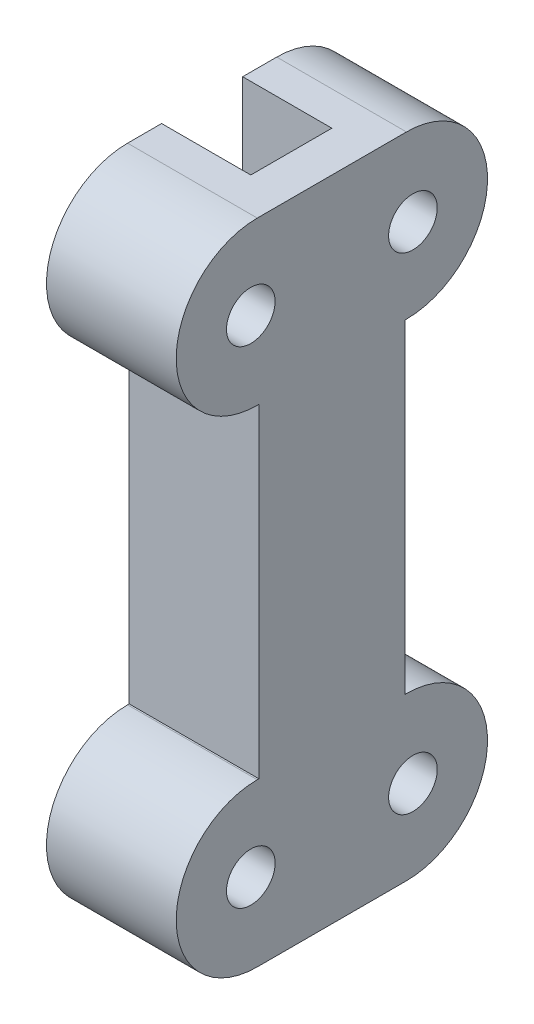
ISO-10303-21;
HEADER;
FILE_DESCRIPTION(('STEP AP214'),'2;1');
FILE_NAME('part.step','',(''),(''),'','','');
FILE_SCHEMA(('AUTOMOTIVE_DESIGN { 1 0 10303 214 1 1 1 1 }'));
ENDSEC;
DATA;
#1=APPLICATION_CONTEXT('core data for automotive mechanical design processes');
#2=APPLICATION_PROTOCOL_DEFINITION('international standard','automotive_design',2000,#1);
#3=PRODUCT_CONTEXT('',#1,'mechanical');
#4=PRODUCT('Part','Part','',(#3));
#5=PRODUCT_RELATED_PRODUCT_CATEGORY('part','',(#4));
#6=PRODUCT_DEFINITION_FORMATION('','',#4);
#7=PRODUCT_DEFINITION_CONTEXT('part definition',#1,'design');
#8=PRODUCT_DEFINITION('design','',#6,#7);
#9=PRODUCT_DEFINITION_SHAPE('','',#8);
#10=(LENGTH_UNIT() NAMED_UNIT(*) SI_UNIT(.MILLI.,.METRE.));
#11=(NAMED_UNIT(*) PLANE_ANGLE_UNIT() SI_UNIT($,.RADIAN.));
#12=(NAMED_UNIT(*) SI_UNIT($,.STERADIAN.) SOLID_ANGLE_UNIT());
#13=UNCERTAINTY_MEASURE_WITH_UNIT(LENGTH_MEASURE(1.E-05),#10,'distance_accuracy_value','');
#14=(GEOMETRIC_REPRESENTATION_CONTEXT(3) GLOBAL_UNCERTAINTY_ASSIGNED_CONTEXT((#13)) GLOBAL_UNIT_ASSIGNED_CONTEXT((#10,
#11,#12)) REPRESENTATION_CONTEXT('',''));
#15=CARTESIAN_POINT('',(0.,0.,0.));
#16=DIRECTION('',(0.,0.,1.));
#17=DIRECTION('',(1.,0.,0.));
#18=AXIS2_PLACEMENT_3D('',#15,#16,#17);
#19=CARTESIAN_POINT('',(8.,-20.,4.5));
#20=DIRECTION('',(0.,0.,-1.));
#21=DIRECTION('',(-1.,0.,0.));
#22=AXIS2_PLACEMENT_3D('',#19,#20,#21);
#23=PLANE('',#22);
#24=DIRECTION('',(-1.,0.,0.));
#25=VECTOR('',#24,1.);
#26=CARTESIAN_POINT('',(0.,-9.99999999999999,4.5));
#27=LINE('',#26,#25);
#28=CARTESIAN_POINT('',(8.,-9.99999999999999,4.5));
#29=VERTEX_POINT('',#28);
#30=CARTESIAN_POINT('',(0.,-9.99999999999999,4.5));
#31=VERTEX_POINT('',#30);
#32=EDGE_CURVE('E210',#29,#31,#27,.T.);
#33=ORIENTED_EDGE('',*,*,#32,.F.);
#34=DIRECTION('',(0.,-1.,0.));
#35=VECTOR('',#34,1.);
#36=CARTESIAN_POINT('',(8.,-20.,4.5));
#37=LINE('',#36,#35);
#38=CARTESIAN_POINT('',(8.,9.99999999999999,4.5));
#39=VERTEX_POINT('',#38);
#40=EDGE_CURVE('E66',#39,#29,#37,.T.);
#41=ORIENTED_EDGE('',*,*,#40,.F.);
#42=DIRECTION('',(-1.,0.,0.));
#43=VECTOR('',#42,1.);
#44=CARTESIAN_POINT('',(0.,9.99999999999999,4.5));
#45=LINE('',#44,#43);
#46=CARTESIAN_POINT('',(0.,9.99999999999999,4.5));
#47=VERTEX_POINT('',#46);
#48=EDGE_CURVE('E234',#39,#47,#45,.T.);
#49=ORIENTED_EDGE('',*,*,#48,.T.);
#50=DIRECTION('',(0.,-1.,0.));
#51=VECTOR('',#50,1.);
#52=CARTESIAN_POINT('',(0.,-20.,4.5));
#53=LINE('',#52,#51);
#54=EDGE_CURVE('E309',#47,#31,#53,.T.);
#55=ORIENTED_EDGE('',*,*,#54,.T.);
#56=EDGE_LOOP('',(#33,#41,#49,#55));
#57=FACE_BOUND('',#56,.T.);
#58=ADVANCED_FACE('F57',(#57),#23,.F.);
#59=CARTESIAN_POINT('',(8.,-20.,-4.5));
#60=DIRECTION('',(0.,0.,1.));
#61=DIRECTION('',(1.,0.,0.));
#62=AXIS2_PLACEMENT_3D('',#59,#60,#61);
#63=PLANE('',#62);
#64=DIRECTION('',(0.,1.,0.));
#65=VECTOR('',#64,1.);
#66=CARTESIAN_POINT('',(8.,-20.,-4.5));
#67=LINE('',#66,#65);
#68=CARTESIAN_POINT('',(8.,-9.99999999999999,-4.5));
#69=VERTEX_POINT('',#68);
#70=CARTESIAN_POINT('',(8.,9.99999999999999,-4.5));
#71=VERTEX_POINT('',#70);
#72=EDGE_CURVE('E74',#69,#71,#67,.T.);
#73=ORIENTED_EDGE('',*,*,#72,.F.);
#74=DIRECTION('',(-1.,0.,0.));
#75=VECTOR('',#74,1.);
#76=CARTESIAN_POINT('',(0.,-9.99999999999999,-4.5));
#77=LINE('',#76,#75);
#78=CARTESIAN_POINT('',(0.,-9.99999999999999,-4.5));
#79=VERTEX_POINT('',#78);
#80=EDGE_CURVE('E185',#69,#79,#77,.T.);
#81=ORIENTED_EDGE('',*,*,#80,.T.);
#82=DIRECTION('',(0.,1.,0.));
#83=VECTOR('',#82,1.);
#84=CARTESIAN_POINT('',(0.,-20.,-4.5));
#85=LINE('',#84,#83);
#86=CARTESIAN_POINT('',(0.,9.99999999999999,-4.5));
#87=VERTEX_POINT('',#86);
#88=EDGE_CURVE('E291',#79,#87,#85,.T.);
#89=ORIENTED_EDGE('',*,*,#88,.T.);
#90=DIRECTION('',(-1.,0.,0.));
#91=VECTOR('',#90,1.);
#92=CARTESIAN_POINT('',(0.,9.99999999999999,-4.5));
#93=LINE('',#92,#91);
#94=EDGE_CURVE('E255',#71,#87,#93,.T.);
#95=ORIENTED_EDGE('',*,*,#94,.F.);
#96=EDGE_LOOP('',(#73,#81,#89,#95));
#97=FACE_BOUND('',#96,.T.);
#98=ADVANCED_FACE('F59',(#97),#63,.F.);
#99=CARTESIAN_POINT('',(0.,0.,0.));
#100=DIRECTION('',(-1.,0.,0.));
#101=DIRECTION('',(0.,0.,1.));
#102=AXIS2_PLACEMENT_3D('',#99,#100,#101);
#103=PLANE('',#102);
#104=CARTESIAN_POINT('',(0.,-15.,5.));
#105=DIRECTION('',(-1.,0.,0.));
#106=DIRECTION('',(0.,0.,-1.));
#107=AXIS2_PLACEMENT_3D('',#104,#105,#106);
#108=CIRCLE('',#107,1.5);
#109=CARTESIAN_POINT('',(0.,-15.,3.5));
#110=VERTEX_POINT('',#109);
#111=EDGE_CURVE('E197',#110,#110,#108,.T.);
#112=ORIENTED_EDGE('',*,*,#111,.F.);
#113=EDGE_LOOP('',(#112));
#114=FACE_BOUND('',#113,.T.);
#115=CARTESIAN_POINT('',(0.,15.,5.));
#116=DIRECTION('',(1.,0.,0.));
#117=DIRECTION('',(0.,0.,-1.));
#118=AXIS2_PLACEMENT_3D('',#115,#116,#117);
#119=CIRCLE('',#118,1.5);
#120=CARTESIAN_POINT('',(0.,15.,3.5));
#121=VERTEX_POINT('',#120);
#122=EDGE_CURVE('E225',#121,#121,#119,.T.);
#123=ORIENTED_EDGE('',*,*,#122,.T.);
#124=EDGE_LOOP('',(#123));
#125=FACE_BOUND('',#124,.T.);
#126=DIRECTION('',(0.,1.,0.));
#127=VECTOR('',#126,1.);
#128=CARTESIAN_POINT('',(0.,-20.,2.5));
#129=LINE('',#128,#127);
#130=CARTESIAN_POINT('',(0.,-20.,2.5));
#131=VERTEX_POINT('',#130);
#132=CARTESIAN_POINT('',(0.,20.,2.5));
#133=VERTEX_POINT('',#132);
#134=EDGE_CURVE('E272',#131,#133,#129,.T.);
#135=ORIENTED_EDGE('',*,*,#134,.F.);
#136=DIRECTION('',(0.,0.,-1.));
#137=VECTOR('',#136,1.);
#138=CARTESIAN_POINT('',(0.,-20.,4.5));
#139=LINE('',#138,#137);
#140=CARTESIAN_POINT('',(0.,-20.,4.6));
#141=VERTEX_POINT('',#140);
#142=EDGE_CURVE('E61',#141,#131,#139,.T.);
#143=ORIENTED_EDGE('',*,*,#142,.F.);
#144=CARTESIAN_POINT('',(0.,-15.,4.6));
#145=DIRECTION('',(1.,0.,0.));
#146=DIRECTION('',(0.,0.,-1.));
#147=AXIS2_PLACEMENT_3D('',#144,#145,#146);
#148=CIRCLE('',#147,5.);
#149=CARTESIAN_POINT('',(0.,-9.99999999999999,4.6));
#150=VERTEX_POINT('',#149);
#151=EDGE_CURVE('E205',#150,#141,#148,.T.);
#152=ORIENTED_EDGE('',*,*,#151,.F.);
#153=DIRECTION('',(0.,0.,-1.));
#154=VECTOR('',#153,1.);
#155=CARTESIAN_POINT('',(0.,-9.99999999999999,4.6));
#156=LINE('',#155,#154);
#157=EDGE_CURVE('E219',#150,#31,#156,.T.);
#158=ORIENTED_EDGE('',*,*,#157,.T.);
#159=ORIENTED_EDGE('',*,*,#54,.F.);
#160=DIRECTION('',(0.,0.,-1.));
#161=VECTOR('',#160,1.);
#162=CARTESIAN_POINT('',(0.,9.99999999999999,4.6));
#163=LINE('',#162,#161);
#164=CARTESIAN_POINT('',(0.,9.99999999999999,4.6));
#165=VERTEX_POINT('',#164);
#166=EDGE_CURVE('E82',#165,#47,#163,.T.);
#167=ORIENTED_EDGE('',*,*,#166,.F.);
#168=CARTESIAN_POINT('',(0.,15.,4.6));
#169=DIRECTION('',(-1.,0.,0.));
#170=DIRECTION('',(0.,0.,-1.));
#171=AXIS2_PLACEMENT_3D('',#168,#169,#170);
#172=CIRCLE('',#171,5.);
#173=CARTESIAN_POINT('',(0.,20.,4.6));
#174=VERTEX_POINT('',#173);
#175=EDGE_CURVE('E229',#165,#174,#172,.T.);
#176=ORIENTED_EDGE('',*,*,#175,.T.);
#177=DIRECTION('',(0.,0.,1.));
#178=VECTOR('',#177,1.);
#179=CARTESIAN_POINT('',(0.,20.,4.5));
#180=LINE('',#179,#178);
#181=EDGE_CURVE('E306',#133,#174,#180,.T.);
#182=ORIENTED_EDGE('',*,*,#181,.F.);
#183=EDGE_LOOP('',(#135,#143,#152,#158,#159,#167,#176,#182));
#184=FACE_BOUND('',#183,.T.);
#185=ADVANCED_FACE('F326',(#114,#125,#184),#103,.T.);
#186=CARTESIAN_POINT('',(8.,20.,4.5));
#187=DIRECTION('',(0.,-1.,0.));
#188=DIRECTION('',(0.,0.,-1.));
#189=AXIS2_PLACEMENT_3D('',#186,#187,#188);
#190=PLANE('',#189);
#191=DIRECTION('',(0.,0.,-1.));
#192=VECTOR('',#191,1.);
#193=CARTESIAN_POINT('',(5.5,20.,-2.5));
#194=LINE('',#193,#192);
#195=CARTESIAN_POINT('',(5.5,20.,2.5));
#196=VERTEX_POINT('',#195);
#197=CARTESIAN_POINT('',(5.5,20.,-2.5));
#198=VERTEX_POINT('',#197);
#199=EDGE_CURVE('E276',#196,#198,#194,.T.);
#200=ORIENTED_EDGE('',*,*,#199,.F.);
#201=DIRECTION('',(-1.,0.,0.));
#202=VECTOR('',#201,1.);
#203=CARTESIAN_POINT('',(5.5,20.,2.5));
#204=LINE('',#203,#202);
#205=EDGE_CURVE('E286',#196,#133,#204,.T.);
#206=ORIENTED_EDGE('',*,*,#205,.T.);
#207=ORIENTED_EDGE('',*,*,#181,.T.);
#208=DIRECTION('',(1.,0.,0.));
#209=VECTOR('',#208,1.);
#210=CARTESIAN_POINT('',(0.,20.,4.6));
#211=LINE('',#210,#209);
#212=CARTESIAN_POINT('',(8.,20.,4.6));
#213=VERTEX_POINT('',#212);
#214=EDGE_CURVE('E238',#174,#213,#211,.T.);
#215=ORIENTED_EDGE('',*,*,#214,.T.);
#216=DIRECTION('',(0.,0.,1.));
#217=VECTOR('',#216,1.);
#218=CARTESIAN_POINT('',(8.,20.,4.5));
#219=LINE('',#218,#217);
#220=CARTESIAN_POINT('',(8.,20.,-4.6));
#221=VERTEX_POINT('',#220);
#222=EDGE_CURVE('E300',#221,#213,#219,.T.);
#223=ORIENTED_EDGE('',*,*,#222,.F.);
#224=DIRECTION('',(1.,0.,0.));
#225=VECTOR('',#224,1.);
#226=CARTESIAN_POINT('',(0.,20.,-4.6));
#227=LINE('',#226,#225);
#228=CARTESIAN_POINT('',(0.,20.,-4.6));
#229=VERTEX_POINT('',#228);
#230=EDGE_CURVE('E258',#229,#221,#227,.T.);
#231=ORIENTED_EDGE('',*,*,#230,.F.);
#232=CARTESIAN_POINT('',(0.,20.,-2.5));
#233=VERTEX_POINT('',#232);
#234=EDGE_CURVE('E307',#229,#233,#180,.T.);
#235=ORIENTED_EDGE('',*,*,#234,.T.);
#236=DIRECTION('',(-1.,0.,0.));
#237=VECTOR('',#236,1.);
#238=CARTESIAN_POINT('',(5.5,20.,-2.5));
#239=LINE('',#238,#237);
#240=EDGE_CURVE('E295',#198,#233,#239,.T.);
#241=ORIENTED_EDGE('',*,*,#240,.F.);
#242=EDGE_LOOP('',(#200,#206,#207,#215,#223,#231,#235,#241));
#243=FACE_BOUND('',#242,.T.);
#244=ADVANCED_FACE('F344',(#243),#190,.F.);
#245=CARTESIAN_POINT('',(8.,-20.,4.5));
#246=DIRECTION('',(0.,1.,0.));
#247=DIRECTION('',(0.,0.,1.));
#248=AXIS2_PLACEMENT_3D('',#245,#246,#247);
#249=PLANE('',#248);
#250=ORIENTED_EDGE('',*,*,#142,.T.);
#251=DIRECTION('',(-1.,0.,0.));
#252=VECTOR('',#251,1.);
#253=CARTESIAN_POINT('',(5.5,-20.,2.5));
#254=LINE('',#253,#252);
#255=CARTESIAN_POINT('',(5.5,-20.,2.5));
#256=VERTEX_POINT('',#255);
#257=EDGE_CURVE('E289',#256,#131,#254,.T.);
#258=ORIENTED_EDGE('',*,*,#257,.F.);
#259=DIRECTION('',(0.,0.,1.));
#260=VECTOR('',#259,1.);
#261=CARTESIAN_POINT('',(5.5,-20.,-2.5));
#262=LINE('',#261,#260);
#263=CARTESIAN_POINT('',(5.5,-20.,-2.5));
#264=VERTEX_POINT('',#263);
#265=EDGE_CURVE('E283',#264,#256,#262,.T.);
#266=ORIENTED_EDGE('',*,*,#265,.F.);
#267=DIRECTION('',(-1.,0.,0.));
#268=VECTOR('',#267,1.);
#269=CARTESIAN_POINT('',(5.5,-20.,-2.5));
#270=LINE('',#269,#268);
#271=CARTESIAN_POINT('',(0.,-20.,-2.5));
#272=VERTEX_POINT('',#271);
#273=EDGE_CURVE('E292',#264,#272,#270,.T.);
#274=ORIENTED_EDGE('',*,*,#273,.T.);
#275=CARTESIAN_POINT('',(0.,-20.,-4.6));
#276=VERTEX_POINT('',#275);
#277=EDGE_CURVE('E311',#272,#276,#139,.T.);
#278=ORIENTED_EDGE('',*,*,#277,.T.);
#279=DIRECTION('',(1.,0.,0.));
#280=VECTOR('',#279,1.);
#281=CARTESIAN_POINT('',(0.,-20.,-4.6));
#282=LINE('',#281,#280);
#283=CARTESIAN_POINT('',(8.,-20.,-4.6));
#284=VERTEX_POINT('',#283);
#285=EDGE_CURVE('E184',#276,#284,#282,.T.);
#286=ORIENTED_EDGE('',*,*,#285,.T.);
#287=DIRECTION('',(0.,0.,-1.));
#288=VECTOR('',#287,1.);
#289=CARTESIAN_POINT('',(8.,-20.,4.5));
#290=LINE('',#289,#288);
#291=CARTESIAN_POINT('',(8.,-20.,4.6));
#292=VERTEX_POINT('',#291);
#293=EDGE_CURVE('E12',#292,#284,#290,.T.);
#294=ORIENTED_EDGE('',*,*,#293,.F.);
#295=DIRECTION('',(1.,0.,0.));
#296=VECTOR('',#295,1.);
#297=CARTESIAN_POINT('',(0.,-20.,4.6));
#298=LINE('',#297,#296);
#299=EDGE_CURVE('E213',#141,#292,#298,.T.);
#300=ORIENTED_EDGE('',*,*,#299,.F.);
#301=EDGE_LOOP('',(#250,#258,#266,#274,#278,#286,#294,#300));
#302=FACE_BOUND('',#301,.T.);
#303=ADVANCED_FACE('F321',(#302),#249,.F.);
#304=CARTESIAN_POINT('',(8.,0.,0.));
#305=DIRECTION('',(-1.,0.,0.));
#306=DIRECTION('',(0.,0.,1.));
#307=AXIS2_PLACEMENT_3D('',#304,#305,#306);
#308=PLANE('',#307);
#309=CARTESIAN_POINT('',(8.,-15.,-5.));
#310=DIRECTION('',(1.,0.,0.));
#311=DIRECTION('',(0.,0.,1.));
#312=AXIS2_PLACEMENT_3D('',#309,#310,#311);
#313=CIRCLE('',#312,1.5);
#314=CARTESIAN_POINT('',(8.,-15.,-3.5));
#315=VERTEX_POINT('',#314);
#316=EDGE_CURVE('E355',#315,#315,#313,.T.);
#317=ORIENTED_EDGE('',*,*,#316,.F.);
#318=EDGE_LOOP('',(#317));
#319=FACE_BOUND('',#318,.T.);
#320=CARTESIAN_POINT('',(8.,-15.,5.));
#321=DIRECTION('',(-1.,0.,0.));
#322=DIRECTION('',(0.,0.,-1.));
#323=AXIS2_PLACEMENT_3D('',#320,#321,#322);
#324=CIRCLE('',#323,1.5);
#325=CARTESIAN_POINT('',(8.,-15.,3.5));
#326=VERTEX_POINT('',#325);
#327=EDGE_CURVE('E202',#326,#326,#324,.T.);
#328=ORIENTED_EDGE('',*,*,#327,.T.);
#329=EDGE_LOOP('',(#328));
#330=FACE_BOUND('',#329,.T.);
#331=CARTESIAN_POINT('',(8.,15.,5.));
#332=DIRECTION('',(1.,0.,0.));
#333=DIRECTION('',(0.,0.,-1.));
#334=AXIS2_PLACEMENT_3D('',#331,#332,#333);
#335=CIRCLE('',#334,1.5);
#336=CARTESIAN_POINT('',(8.,15.,3.5));
#337=VERTEX_POINT('',#336);
#338=EDGE_CURVE('E226',#337,#337,#335,.T.);
#339=ORIENTED_EDGE('',*,*,#338,.F.);
#340=EDGE_LOOP('',(#339));
#341=FACE_BOUND('',#340,.T.);
#342=CARTESIAN_POINT('',(8.,15.,-5.));
#343=DIRECTION('',(-1.,0.,0.));
#344=DIRECTION('',(0.,0.,1.));
#345=AXIS2_PLACEMENT_3D('',#342,#343,#344);
#346=CIRCLE('',#345,1.5);
#347=CARTESIAN_POINT('',(8.,15.,-3.5));
#348=VERTEX_POINT('',#347);
#349=EDGE_CURVE('E246',#348,#348,#346,.T.);
#350=ORIENTED_EDGE('',*,*,#349,.T.);
#351=EDGE_LOOP('',(#350));
#352=FACE_BOUND('',#351,.T.);
#353=ORIENTED_EDGE('',*,*,#293,.T.);
#354=CARTESIAN_POINT('',(8.,-15.,-4.6));
#355=DIRECTION('',(-1.,0.,0.));
#356=DIRECTION('',(0.,0.,1.));
#357=AXIS2_PLACEMENT_3D('',#354,#355,#356);
#358=CIRCLE('',#357,5.);
#359=CARTESIAN_POINT('',(8.,-9.99999999999999,-4.6));
#360=VERTEX_POINT('',#359);
#361=EDGE_CURVE('E178',#360,#284,#358,.T.);
#362=ORIENTED_EDGE('',*,*,#361,.F.);
#363=DIRECTION('',(0.,0.,1.));
#364=VECTOR('',#363,1.);
#365=CARTESIAN_POINT('',(8.,-9.99999999999999,-4.6));
#366=LINE('',#365,#364);
#367=EDGE_CURVE('E189',#360,#69,#366,.T.);
#368=ORIENTED_EDGE('',*,*,#367,.T.);
#369=ORIENTED_EDGE('',*,*,#72,.T.);
#370=DIRECTION('',(0.,0.,1.));
#371=VECTOR('',#370,1.);
#372=CARTESIAN_POINT('',(8.,9.99999999999999,-4.6));
#373=LINE('',#372,#371);
#374=CARTESIAN_POINT('',(8.,9.99999999999999,-4.6));
#375=VERTEX_POINT('',#374);
#376=EDGE_CURVE('E269',#375,#71,#373,.T.);
#377=ORIENTED_EDGE('',*,*,#376,.F.);
#378=CARTESIAN_POINT('',(8.,15.,-4.6));
#379=DIRECTION('',(1.,0.,0.));
#380=DIRECTION('',(0.,0.,1.));
#381=AXIS2_PLACEMENT_3D('',#378,#379,#380);
#382=CIRCLE('',#381,5.);
#383=EDGE_CURVE('E252',#375,#221,#382,.T.);
#384=ORIENTED_EDGE('',*,*,#383,.T.);
#385=ORIENTED_EDGE('',*,*,#222,.T.);
#386=CARTESIAN_POINT('',(8.,15.,4.6));
#387=DIRECTION('',(-1.,0.,0.));
#388=DIRECTION('',(0.,0.,-1.));
#389=AXIS2_PLACEMENT_3D('',#386,#387,#388);
#390=CIRCLE('',#389,5.);
#391=CARTESIAN_POINT('',(8.,9.99999999999999,4.6));
#392=VERTEX_POINT('',#391);
#393=EDGE_CURVE('E232',#392,#213,#390,.T.);
#394=ORIENTED_EDGE('',*,*,#393,.F.);
#395=DIRECTION('',(0.,0.,-1.));
#396=VECTOR('',#395,1.);
#397=CARTESIAN_POINT('',(8.,9.99999999999999,4.6));
#398=LINE('',#397,#396);
#399=EDGE_CURVE('E241',#392,#39,#398,.T.);
#400=ORIENTED_EDGE('',*,*,#399,.T.);
#401=ORIENTED_EDGE('',*,*,#40,.T.);
#402=DIRECTION('',(0.,0.,-1.));
#403=VECTOR('',#402,1.);
#404=CARTESIAN_POINT('',(8.,-9.99999999999999,4.6));
#405=LINE('',#404,#403);
#406=CARTESIAN_POINT('',(8.,-9.99999999999999,4.6));
#407=VERTEX_POINT('',#406);
#408=EDGE_CURVE('E223',#407,#29,#405,.T.);
#409=ORIENTED_EDGE('',*,*,#408,.F.);
#410=CARTESIAN_POINT('',(8.,-15.,4.6));
#411=DIRECTION('',(1.,0.,0.));
#412=DIRECTION('',(0.,0.,-1.));
#413=AXIS2_PLACEMENT_3D('',#410,#411,#412);
#414=CIRCLE('',#413,5.);
#415=EDGE_CURVE('E208',#407,#292,#414,.T.);
#416=ORIENTED_EDGE('',*,*,#415,.T.);
#417=EDGE_LOOP('',(#353,#362,#368,#369,#377,#384,#385,#394,#400,#401,#409,#416));
#418=FACE_BOUND('',#417,.T.);
#419=ADVANCED_FACE('F188',(#319,#330,#341,#352,#418),#308,.F.);
#420=CARTESIAN_POINT('',(0.,-15.,-5.));
#421=DIRECTION('',(1.,0.,0.));
#422=DIRECTION('',(0.,0.,1.));
#423=AXIS2_PLACEMENT_3D('',#420,#421,#422);
#424=CIRCLE('',#423,1.5);
#425=CARTESIAN_POINT('',(0.,-15.,-3.5));
#426=VERTEX_POINT('',#425);
#427=EDGE_CURVE('E388',#426,#426,#424,.T.);
#428=ORIENTED_EDGE('',*,*,#427,.T.);
#429=EDGE_LOOP('',(#428));
#430=FACE_BOUND('',#429,.T.);
#431=CARTESIAN_POINT('',(0.,15.,-5.));
#432=DIRECTION('',(-1.,0.,0.));
#433=DIRECTION('',(0.,0.,1.));
#434=AXIS2_PLACEMENT_3D('',#431,#432,#433);
#435=CIRCLE('',#434,1.5);
#436=CARTESIAN_POINT('',(0.,15.,-3.5));
#437=VERTEX_POINT('',#436);
#438=EDGE_CURVE('E245',#437,#437,#435,.T.);
#439=ORIENTED_EDGE('',*,*,#438,.F.);
#440=EDGE_LOOP('',(#439));
#441=FACE_BOUND('',#440,.T.);
#442=DIRECTION('',(0.,-1.,0.));
#443=VECTOR('',#442,1.);
#444=CARTESIAN_POINT('',(0.,-20.,-2.5));
#445=LINE('',#444,#443);
#446=EDGE_CURVE('E277',#233,#272,#445,.T.);
#447=ORIENTED_EDGE('',*,*,#446,.F.);
#448=ORIENTED_EDGE('',*,*,#234,.F.);
#449=CARTESIAN_POINT('',(0.,15.,-4.6));
#450=DIRECTION('',(1.,0.,0.));
#451=DIRECTION('',(0.,0.,1.));
#452=AXIS2_PLACEMENT_3D('',#449,#450,#451);
#453=CIRCLE('',#452,5.);
#454=CARTESIAN_POINT('',(0.,9.99999999999999,-4.6));
#455=VERTEX_POINT('',#454);
#456=EDGE_CURVE('E249',#455,#229,#453,.T.);
#457=ORIENTED_EDGE('',*,*,#456,.F.);
#458=DIRECTION('',(0.,0.,1.));
#459=VECTOR('',#458,1.);
#460=CARTESIAN_POINT('',(0.,9.99999999999999,-4.6));
#461=LINE('',#460,#459);
#462=EDGE_CURVE('E264',#455,#87,#461,.T.);
#463=ORIENTED_EDGE('',*,*,#462,.T.);
#464=ORIENTED_EDGE('',*,*,#88,.F.);
#465=DIRECTION('',(0.,0.,1.));
#466=VECTOR('',#465,1.);
#467=CARTESIAN_POINT('',(0.,-9.99999999999999,-4.6));
#468=LINE('',#467,#466);
#469=CARTESIAN_POINT('',(0.,-9.99999999999999,-4.6));
#470=VERTEX_POINT('',#469);
#471=EDGE_CURVE('E195',#470,#79,#468,.T.);
#472=ORIENTED_EDGE('',*,*,#471,.F.);
#473=CARTESIAN_POINT('',(0.,-15.,-4.6));
#474=DIRECTION('',(-1.,0.,0.));
#475=DIRECTION('',(0.,0.,1.));
#476=AXIS2_PLACEMENT_3D('',#473,#474,#475);
#477=CIRCLE('',#476,5.);
#478=EDGE_CURVE('E179',#470,#276,#477,.T.);
#479=ORIENTED_EDGE('',*,*,#478,.T.);
#480=ORIENTED_EDGE('',*,*,#277,.F.);
#481=EDGE_LOOP('',(#447,#448,#457,#463,#464,#472,#479,#480));
#482=FACE_BOUND('',#481,.T.);
#483=ADVANCED_FACE('F353',(#430,#441,#482),#103,.T.);
#484=CARTESIAN_POINT('',(5.5,-20.,2.5));
#485=DIRECTION('',(0.,0.,1.));
#486=DIRECTION('',(1.,0.,0.));
#487=AXIS2_PLACEMENT_3D('',#484,#485,#486);
#488=PLANE('',#487);
#489=ORIENTED_EDGE('',*,*,#134,.T.);
#490=ORIENTED_EDGE('',*,*,#205,.F.);
#491=DIRECTION('',(0.,1.,0.));
#492=VECTOR('',#491,1.);
#493=CARTESIAN_POINT('',(5.5,-20.,2.5));
#494=LINE('',#493,#492);
#495=EDGE_CURVE('E273',#256,#196,#494,.T.);
#496=ORIENTED_EDGE('',*,*,#495,.F.);
#497=ORIENTED_EDGE('',*,*,#257,.T.);
#498=EDGE_LOOP('',(#489,#490,#496,#497));
#499=FACE_BOUND('',#498,.T.);
#500=ADVANCED_FACE('F347',(#499),#488,.F.);
#501=CARTESIAN_POINT('',(5.5,-20.,-2.5));
#502=DIRECTION('',(0.,0.,-1.));
#503=DIRECTION('',(-1.,0.,0.));
#504=AXIS2_PLACEMENT_3D('',#501,#502,#503);
#505=PLANE('',#504);
#506=ORIENTED_EDGE('',*,*,#446,.T.);
#507=ORIENTED_EDGE('',*,*,#273,.F.);
#508=DIRECTION('',(0.,-1.,0.));
#509=VECTOR('',#508,1.);
#510=CARTESIAN_POINT('',(5.5,-20.,-2.5));
#511=LINE('',#510,#509);
#512=EDGE_CURVE('E280',#198,#264,#511,.T.);
#513=ORIENTED_EDGE('',*,*,#512,.F.);
#514=ORIENTED_EDGE('',*,*,#240,.T.);
#515=EDGE_LOOP('',(#506,#507,#513,#514));
#516=FACE_BOUND('',#515,.T.);
#517=ADVANCED_FACE('F382',(#516),#505,.F.);
#518=CARTESIAN_POINT('',(5.5,0.,0.));
#519=DIRECTION('',(1.,0.,0.));
#520=DIRECTION('',(0.,0.,-1.));
#521=AXIS2_PLACEMENT_3D('',#518,#519,#520);
#522=PLANE('',#521);
#523=ORIENTED_EDGE('',*,*,#495,.T.);
#524=ORIENTED_EDGE('',*,*,#199,.T.);
#525=ORIENTED_EDGE('',*,*,#512,.T.);
#526=ORIENTED_EDGE('',*,*,#265,.T.);
#527=EDGE_LOOP('',(#523,#524,#525,#526));
#528=FACE_BOUND('',#527,.T.);
#529=ADVANCED_FACE('F349',(#528),#522,.F.);
#530=CARTESIAN_POINT('',(0.,9.99999999999999,-4.6));
#531=DIRECTION('',(0.,1.,0.));
#532=DIRECTION('',(0.,0.,1.));
#533=AXIS2_PLACEMENT_3D('',#530,#531,#532);
#534=PLANE('',#533);
#535=ORIENTED_EDGE('',*,*,#94,.T.);
#536=ORIENTED_EDGE('',*,*,#462,.F.);
#537=DIRECTION('',(-1.,0.,0.));
#538=VECTOR('',#537,1.);
#539=CARTESIAN_POINT('',(0.,9.99999999999999,-4.6));
#540=LINE('',#539,#538);
#541=EDGE_CURVE('E261',#375,#455,#540,.T.);
#542=ORIENTED_EDGE('',*,*,#541,.F.);
#543=ORIENTED_EDGE('',*,*,#376,.T.);
#544=EDGE_LOOP('',(#535,#536,#542,#543));
#545=FACE_BOUND('',#544,.T.);
#546=ADVANCED_FACE('F401',(#545),#534,.F.);
#547=CARTESIAN_POINT('',(8.,15.,-4.6));
#548=DIRECTION('',(-1.,0.,0.));
#549=DIRECTION('',(0.,0.,1.));
#550=AXIS2_PLACEMENT_3D('',#547,#548,#549);
#551=CYLINDRICAL_SURFACE('',#550,5.);
#552=ORIENTED_EDGE('',*,*,#456,.T.);
#553=ORIENTED_EDGE('',*,*,#230,.T.);
#554=ORIENTED_EDGE('',*,*,#383,.F.);
#555=ORIENTED_EDGE('',*,*,#541,.T.);
#556=EDGE_LOOP('',(#552,#553,#554,#555));
#557=FACE_BOUND('',#556,.T.);
#558=ADVANCED_FACE('F393',(#557),#551,.T.);
#559=CARTESIAN_POINT('',(8.,15.,-5.));
#560=DIRECTION('',(-1.,0.,0.));
#561=DIRECTION('',(0.,0.,1.));
#562=AXIS2_PLACEMENT_3D('',#559,#560,#561);
#563=CYLINDRICAL_SURFACE('',#562,1.5);
#564=ORIENTED_EDGE('',*,*,#349,.F.);
#565=EDGE_LOOP('',(#564));
#566=FACE_BOUND('',#565,.T.);
#567=ORIENTED_EDGE('',*,*,#438,.T.);
#568=EDGE_LOOP('',(#567));
#569=FACE_BOUND('',#568,.T.);
#570=ADVANCED_FACE('F391',(#566,#569),#563,.F.);
#571=CARTESIAN_POINT('',(0.,9.99999999999999,4.6));
#572=DIRECTION('',(0.,-1.,0.));
#573=DIRECTION('',(0.,0.,-1.));
#574=AXIS2_PLACEMENT_3D('',#571,#572,#573);
#575=PLANE('',#574);
#576=ORIENTED_EDGE('',*,*,#48,.F.);
#577=ORIENTED_EDGE('',*,*,#399,.F.);
#578=DIRECTION('',(-1.,0.,0.));
#579=VECTOR('',#578,1.);
#580=CARTESIAN_POINT('',(0.,9.99999999999999,4.6));
#581=LINE('',#580,#579);
#582=EDGE_CURVE('E236',#392,#165,#581,.T.);
#583=ORIENTED_EDGE('',*,*,#582,.T.);
#584=ORIENTED_EDGE('',*,*,#166,.T.);
#585=EDGE_LOOP('',(#576,#577,#583,#584));
#586=FACE_BOUND('',#585,.T.);
#587=ADVANCED_FACE('F336',(#586),#575,.T.);
#588=CARTESIAN_POINT('',(8.,15.,4.6));
#589=DIRECTION('',(-1.,0.,0.));
#590=DIRECTION('',(0.,0.,1.));
#591=AXIS2_PLACEMENT_3D('',#588,#589,#590);
#592=CYLINDRICAL_SURFACE('',#591,5.);
#593=ORIENTED_EDGE('',*,*,#175,.F.);
#594=ORIENTED_EDGE('',*,*,#582,.F.);
#595=ORIENTED_EDGE('',*,*,#393,.T.);
#596=ORIENTED_EDGE('',*,*,#214,.F.);
#597=EDGE_LOOP('',(#593,#594,#595,#596));
#598=FACE_BOUND('',#597,.T.);
#599=ADVANCED_FACE('F339',(#598),#592,.T.);
#600=CARTESIAN_POINT('',(8.,15.,5.));
#601=DIRECTION('',(-1.,0.,0.));
#602=DIRECTION('',(0.,0.,1.));
#603=AXIS2_PLACEMENT_3D('',#600,#601,#602);
#604=CYLINDRICAL_SURFACE('',#603,1.5);
#605=ORIENTED_EDGE('',*,*,#338,.T.);
#606=EDGE_LOOP('',(#605));
#607=FACE_BOUND('',#606,.T.);
#608=ORIENTED_EDGE('',*,*,#122,.F.);
#609=EDGE_LOOP('',(#608));
#610=FACE_BOUND('',#609,.T.);
#611=ADVANCED_FACE('F459',(#607,#610),#604,.F.);
#612=CARTESIAN_POINT('',(0.,-9.99999999999999,4.6));
#613=DIRECTION('',(0.,-1.,0.));
#614=DIRECTION('',(0.,0.,-1.));
#615=AXIS2_PLACEMENT_3D('',#612,#613,#614);
#616=PLANE('',#615);
#617=ORIENTED_EDGE('',*,*,#32,.T.);
#618=ORIENTED_EDGE('',*,*,#157,.F.);
#619=DIRECTION('',(-1.,0.,0.));
#620=VECTOR('',#619,1.);
#621=CARTESIAN_POINT('',(0.,-9.99999999999999,4.6));
#622=LINE('',#621,#620);
#623=EDGE_CURVE('E216',#407,#150,#622,.T.);
#624=ORIENTED_EDGE('',*,*,#623,.F.);
#625=ORIENTED_EDGE('',*,*,#408,.T.);
#626=EDGE_LOOP('',(#617,#618,#624,#625));
#627=FACE_BOUND('',#626,.T.);
#628=ADVANCED_FACE('F333',(#627),#616,.F.);
#629=CARTESIAN_POINT('',(8.,-15.,4.6));
#630=DIRECTION('',(-1.,0.,0.));
#631=DIRECTION('',(0.,0.,1.));
#632=AXIS2_PLACEMENT_3D('',#629,#630,#631);
#633=CYLINDRICAL_SURFACE('',#632,5.);
#634=ORIENTED_EDGE('',*,*,#151,.T.);
#635=ORIENTED_EDGE('',*,*,#299,.T.);
#636=ORIENTED_EDGE('',*,*,#415,.F.);
#637=ORIENTED_EDGE('',*,*,#623,.T.);
#638=EDGE_LOOP('',(#634,#635,#636,#637));
#639=FACE_BOUND('',#638,.T.);
#640=ADVANCED_FACE('F329',(#639),#633,.T.);
#641=CARTESIAN_POINT('',(8.,-15.,5.));
#642=DIRECTION('',(-1.,0.,0.));
#643=DIRECTION('',(0.,0.,1.));
#644=AXIS2_PLACEMENT_3D('',#641,#642,#643);
#645=CYLINDRICAL_SURFACE('',#644,1.5);
#646=ORIENTED_EDGE('',*,*,#327,.F.);
#647=EDGE_LOOP('',(#646));
#648=FACE_BOUND('',#647,.T.);
#649=ORIENTED_EDGE('',*,*,#111,.T.);
#650=EDGE_LOOP('',(#649));
#651=FACE_BOUND('',#650,.T.);
#652=ADVANCED_FACE('F523',(#648,#651),#645,.F.);
#653=CARTESIAN_POINT('',(0.,-9.99999999999999,-4.6));
#654=DIRECTION('',(0.,1.,0.));
#655=DIRECTION('',(0.,0.,1.));
#656=AXIS2_PLACEMENT_3D('',#653,#654,#655);
#657=PLANE('',#656);
#658=ORIENTED_EDGE('',*,*,#80,.F.);
#659=ORIENTED_EDGE('',*,*,#367,.F.);
#660=DIRECTION('',(-1.,0.,0.));
#661=VECTOR('',#660,1.);
#662=CARTESIAN_POINT('',(0.,-9.99999999999999,-4.6));
#663=LINE('',#662,#661);
#664=EDGE_CURVE('E174',#360,#470,#663,.T.);
#665=ORIENTED_EDGE('',*,*,#664,.T.);
#666=ORIENTED_EDGE('',*,*,#471,.T.);
#667=EDGE_LOOP('',(#658,#659,#665,#666));
#668=FACE_BOUND('',#667,.T.);
#669=ADVANCED_FACE('F194',(#668),#657,.T.);
#670=CARTESIAN_POINT('',(8.,-15.,-4.6));
#671=DIRECTION('',(-1.,0.,0.));
#672=DIRECTION('',(0.,0.,1.));
#673=AXIS2_PLACEMENT_3D('',#670,#671,#672);
#674=CYLINDRICAL_SURFACE('',#673,5.);
#675=ORIENTED_EDGE('',*,*,#478,.F.);
#676=ORIENTED_EDGE('',*,*,#664,.F.);
#677=ORIENTED_EDGE('',*,*,#361,.T.);
#678=ORIENTED_EDGE('',*,*,#285,.F.);
#679=EDGE_LOOP('',(#675,#676,#677,#678));
#680=FACE_BOUND('',#679,.T.);
#681=ADVANCED_FACE('F176',(#680),#674,.T.);
#682=CARTESIAN_POINT('',(8.,-15.,-5.));
#683=DIRECTION('',(-1.,0.,0.));
#684=DIRECTION('',(0.,0.,1.));
#685=AXIS2_PLACEMENT_3D('',#682,#683,#684);
#686=CYLINDRICAL_SURFACE('',#685,1.5);
#687=ORIENTED_EDGE('',*,*,#316,.T.);
#688=EDGE_LOOP('',(#687));
#689=FACE_BOUND('',#688,.T.);
#690=ORIENTED_EDGE('',*,*,#427,.F.);
#691=EDGE_LOOP('',(#690));
#692=FACE_BOUND('',#691,.T.);
#693=ADVANCED_FACE('F547',(#689,#692),#686,.F.);
#694=CLOSED_SHELL('',(#58,#98,#185,#244,#303,#419,#483,#500,#517,#529,#546,#558,#570,#587,#599,
#611,#628,#640,#652,#669,#681,#693));
#695=MANIFOLD_SOLID_BREP('B2',#694);
#696=ADVANCED_BREP_SHAPE_REPRESENTATION('',(#18,#695),#14);
#697=SHAPE_DEFINITION_REPRESENTATION(#9,#696);
ENDSEC;
END-ISO-10303-21;
